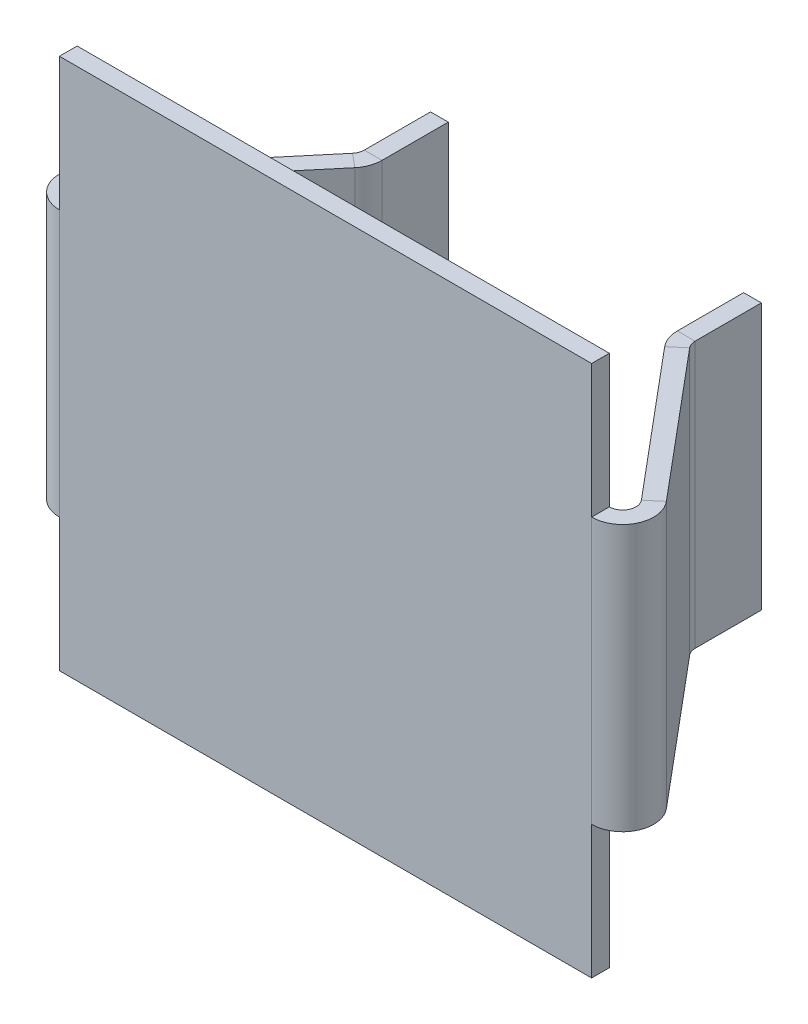
ISO-10303-21;
HEADER;
FILE_DESCRIPTION(('STEP AP214'),'2;1');
FILE_NAME('part.step','',(''),(''),'','','');
FILE_SCHEMA(('AUTOMOTIVE_DESIGN { 1 0 10303 214 1 1 1 1 }'));
ENDSEC;
DATA;
#1=APPLICATION_CONTEXT('core data for automotive mechanical design processes');
#2=APPLICATION_PROTOCOL_DEFINITION('international standard','automotive_design',2000,#1);
#3=PRODUCT_CONTEXT('',#1,'mechanical');
#4=PRODUCT('Part','Part','',(#3));
#5=PRODUCT_RELATED_PRODUCT_CATEGORY('part','',(#4));
#6=PRODUCT_DEFINITION_FORMATION('','',#4);
#7=PRODUCT_DEFINITION_CONTEXT('part definition',#1,'design');
#8=PRODUCT_DEFINITION('design','',#6,#7);
#9=PRODUCT_DEFINITION_SHAPE('','',#8);
#10=(LENGTH_UNIT() NAMED_UNIT(*) SI_UNIT(.MILLI.,.METRE.));
#11=(NAMED_UNIT(*) PLANE_ANGLE_UNIT() SI_UNIT($,.RADIAN.));
#12=(NAMED_UNIT(*) SI_UNIT($,.STERADIAN.) SOLID_ANGLE_UNIT());
#13=UNCERTAINTY_MEASURE_WITH_UNIT(LENGTH_MEASURE(1.E-05),#10,'distance_accuracy_value','');
#14=(GEOMETRIC_REPRESENTATION_CONTEXT(3) GLOBAL_UNCERTAINTY_ASSIGNED_CONTEXT((#13)) GLOBAL_UNIT_ASSIGNED_CONTEXT((#10,
#11,#12)) REPRESENTATION_CONTEXT('',''));
#15=CARTESIAN_POINT('',(0.,0.,0.));
#16=DIRECTION('',(0.,0.,1.));
#17=DIRECTION('',(1.,0.,0.));
#18=AXIS2_PLACEMENT_3D('',#15,#16,#17);
#19=CARTESIAN_POINT('',(46.676759370037,0.,-33.7680866737785));
#20=DIRECTION('',(-0.766044443118979,0.,0.642787609686538));
#21=DIRECTION('',(0.642787609686538,0.,0.766044443118979));
#22=AXIS2_PLACEMENT_3D('',#19,#20,#21);
#23=PLANE('',#22);
#24=DIRECTION('',(-0.642787609686538,0.,-0.766044443118979));
#25=VECTOR('',#24,1.);
#26=CARTESIAN_POINT('',(46.676759370037,-30.,-33.7680866737785));
#27=LINE('',#26,#25);
#28=CARTESIAN_POINT('',(65.3623111018329,-30.,-11.4995132678058));
#29=VERTEX_POINT('',#28);
#30=CARTESIAN_POINT('',(38.0018666706431,-30.,-44.1064212136506));
#31=VERTEX_POINT('',#30);
#32=EDGE_CURVE('E470',#29,#31,#27,.T.);
#33=ORIENTED_EDGE('',*,*,#32,.T.);
#34=DIRECTION('',(0.,1.,0.));
#35=VECTOR('',#34,1.);
#36=CARTESIAN_POINT('',(38.0018666706431,0.,-44.1064212136506));
#37=LINE('',#36,#35);
#38=CARTESIAN_POINT('',(38.0018666706431,30.,-44.1064212136506));
#39=VERTEX_POINT('',#38);
#40=EDGE_CURVE('E94',#31,#39,#37,.T.);
#41=ORIENTED_EDGE('',*,*,#40,.T.);
#42=DIRECTION('',(0.642787609686538,0.,0.766044443118979));
#43=VECTOR('',#42,1.);
#44=CARTESIAN_POINT('',(46.676759370037,30.,-33.7680866737785));
#45=LINE('',#44,#43);
#46=CARTESIAN_POINT('',(65.3623111018328,30.,-11.4995132678058));
#47=VERTEX_POINT('',#46);
#48=EDGE_CURVE('E367',#39,#47,#45,.T.);
#49=ORIENTED_EDGE('',*,*,#48,.T.);
#50=DIRECTION('',(0.,-1.,0.));
#51=VECTOR('',#50,1.);
#52=CARTESIAN_POINT('',(65.3623111018328,30.,-11.4995132678058));
#53=LINE('',#52,#51);
#54=EDGE_CURVE('E339',#29,#47,#53,.F.);
#55=ORIENTED_EDGE('',*,*,#54,.F.);
#56=EDGE_LOOP('',(#33,#41,#49,#55));
#57=FACE_BOUND('',#56,.T.);
#58=ADVANCED_FACE('F85',(#57),#23,.F.);
#59=CARTESIAN_POINT('',(69.4976985340046,30.,-6.57115043874614));
#60=DIRECTION('',(0.,-1.,0.));
#61=DIRECTION('',(0.,0.,-1.));
#62=AXIS2_PLACEMENT_3D('',#59,#60,#61);
#63=PLANE('',#62);
#64=ORIENTED_EDGE('',*,*,#48,.F.);
#65=DIRECTION('',(-0.76604444311898,0.,0.642787609686538));
#66=VECTOR('',#65,1.);
#67=CARTESIAN_POINT('',(38.0018666706431,30.,-44.1064212136506));
#68=LINE('',#67,#66);
#69=CARTESIAN_POINT('',(34.9376888981671,30.,-41.5352707749044));
#70=VERTEX_POINT('',#69);
#71=EDGE_CURVE('E463',#39,#70,#68,.T.);
#72=ORIENTED_EDGE('',*,*,#71,.T.);
#73=DIRECTION('',(-0.642787609686538,0.,-0.766044443118979));
#74=VECTOR('',#73,1.);
#75=CARTESIAN_POINT('',(66.4335207615286,30.,-3.99999999999999));
#76=LINE('',#75,#74);
#77=CARTESIAN_POINT('',(62.2981333293569,30.,-8.9283628290596));
#78=VERTEX_POINT('',#77);
#79=EDGE_CURVE('E89',#70,#78,#76,.F.);
#80=ORIENTED_EDGE('',*,*,#79,.T.);
#81=DIRECTION('',(-0.76604444311898,0.,0.642787609686538));
#82=VECTOR('',#81,1.);
#83=CARTESIAN_POINT('',(65.3623111018328,30.,-11.4995132678058));
#84=LINE('',#83,#82);
#85=EDGE_CURVE('E334',#78,#47,#84,.F.);
#86=ORIENTED_EDGE('',*,*,#85,.T.);
#87=EDGE_LOOP('',(#64,#72,#80,#86));
#88=FACE_BOUND('',#87,.T.);
#89=ADVANCED_FACE('F479',(#88),#63,.F.);
#90=CARTESIAN_POINT('',(26.152266910954,-30.,-58.2282242980635));
#91=DIRECTION('',(0.,1.,0.));
#92=DIRECTION('',(0.,0.,1.));
#93=AXIS2_PLACEMENT_3D('',#90,#91,#92);
#94=PLANE('',#93);
#95=DIRECTION('',(0.642787609686538,0.,0.766044443118979));
#96=VECTOR('',#95,1.);
#97=CARTESIAN_POINT('',(23.0880891384781,-30.,-55.6570738593174));
#98=LINE('',#97,#96);
#99=CARTESIAN_POINT('',(62.2981333293569,-30.,-8.9283628290596));
#100=VERTEX_POINT('',#99);
#101=CARTESIAN_POINT('',(34.9376888981671,-30.,-41.5352707749044));
#102=VERTEX_POINT('',#101);
#103=EDGE_CURVE('E342',#100,#102,#98,.F.);
#104=ORIENTED_EDGE('',*,*,#103,.T.);
#105=DIRECTION('',(0.76604444311898,0.,-0.642787609686538));
#106=VECTOR('',#105,1.);
#107=CARTESIAN_POINT('',(38.0018666706431,-30.,-44.1064212136506));
#108=LINE('',#107,#106);
#109=EDGE_CURVE('E13',#102,#31,#108,.T.);
#110=ORIENTED_EDGE('',*,*,#109,.T.);
#111=ORIENTED_EDGE('',*,*,#32,.F.);
#112=DIRECTION('',(-0.76604444311898,0.,0.642787609686538));
#113=VECTOR('',#112,1.);
#114=CARTESIAN_POINT('',(62.2981333293569,-30.,-8.9283628290596));
#115=LINE('',#114,#113);
#116=EDGE_CURVE('E343',#100,#29,#115,.F.);
#117=ORIENTED_EDGE('',*,*,#116,.F.);
#118=EDGE_LOOP('',(#104,#110,#111,#117));
#119=FACE_BOUND('',#118,.T.);
#120=ADVANCED_FACE('F87',(#119),#94,.F.);
#121=CARTESIAN_POINT('',(-43.6125815975611,0.,-31.1969362350324));
#122=DIRECTION('',(0.766044443118979,0.,0.642787609686538));
#123=DIRECTION('',(0.642787609686538,0.,-0.766044443118979));
#124=AXIS2_PLACEMENT_3D('',#121,#122,#123);
#125=PLANE('',#124);
#126=DIRECTION('',(0.642787609686538,0.,-0.766044443118979));
#127=VECTOR('',#126,1.);
#128=CARTESIAN_POINT('',(-66.4335207615287,-30.,-3.99999999999999));
#129=LINE('',#128,#127);
#130=CARTESIAN_POINT('',(-34.9376888981671,-30.,-41.5352707749045));
#131=VERTEX_POINT('',#130);
#132=CARTESIAN_POINT('',(-62.298133329357,-30.,-8.9283628290596));
#133=VERTEX_POINT('',#132);
#134=EDGE_CURVE('E458',#131,#133,#129,.F.);
#135=ORIENTED_EDGE('',*,*,#134,.F.);
#136=DIRECTION('',(0.,1.,0.));
#137=VECTOR('',#136,1.);
#138=CARTESIAN_POINT('',(-34.9376888981671,0.,-41.5352707749045));
#139=LINE('',#138,#137);
#140=CARTESIAN_POINT('',(-34.9376888981671,30.,-41.5352707749045));
#141=VERTEX_POINT('',#140);
#142=EDGE_CURVE('E437',#131,#141,#139,.T.);
#143=ORIENTED_EDGE('',*,*,#142,.T.);
#144=DIRECTION('',(-0.642787609686538,0.,0.766044443118979));
#145=VECTOR('',#144,1.);
#146=CARTESIAN_POINT('',(-23.0880891384782,30.,-55.6570738593173));
#147=LINE('',#146,#145);
#148=CARTESIAN_POINT('',(-62.298133329357,30.,-8.92836282905961));
#149=VERTEX_POINT('',#148);
#150=EDGE_CURVE('E376',#149,#141,#147,.F.);
#151=ORIENTED_EDGE('',*,*,#150,.F.);
#152=DIRECTION('',(0.,1.,0.));
#153=VECTOR('',#152,1.);
#154=CARTESIAN_POINT('',(-62.298133329357,-30.,-8.9283628290596));
#155=LINE('',#154,#153);
#156=EDGE_CURVE('E380',#133,#149,#155,.T.);
#157=ORIENTED_EDGE('',*,*,#156,.F.);
#158=EDGE_LOOP('',(#135,#143,#151,#157));
#159=FACE_BOUND('',#158,.T.);
#160=ADVANCED_FACE('F570',(#159),#125,.T.);
#161=CARTESIAN_POINT('',(60.,-60.,-4.));
#162=DIRECTION('',(1.,0.,0.));
#163=DIRECTION('',(0.,0.,-1.));
#164=AXIS2_PLACEMENT_3D('',#161,#162,#163);
#165=PLANE('',#164);
#166=DIRECTION('',(0.,1.,0.));
#167=VECTOR('',#166,1.);
#168=CARTESIAN_POINT('',(60.,-60.,-4.));
#169=LINE('',#168,#167);
#170=CARTESIAN_POINT('',(60.,-60.,-4.));
#171=VERTEX_POINT('',#170);
#172=CARTESIAN_POINT('',(60.,-30.,-3.99999999999999));
#173=VERTEX_POINT('',#172);
#174=EDGE_CURVE('E415',#171,#173,#169,.T.);
#175=ORIENTED_EDGE('',*,*,#174,.T.);
#176=DIRECTION('',(0.,0.,1.));
#177=VECTOR('',#176,1.);
#178=CARTESIAN_POINT('',(60.,-30.,-3.99999999999999));
#179=LINE('',#178,#177);
#180=CARTESIAN_POINT('',(60.,-30.,0.));
#181=VERTEX_POINT('',#180);
#182=EDGE_CURVE('E357',#173,#181,#179,.T.);
#183=ORIENTED_EDGE('',*,*,#182,.T.);
#184=DIRECTION('',(0.,1.,0.));
#185=VECTOR('',#184,1.);
#186=CARTESIAN_POINT('',(60.,-60.,0.));
#187=LINE('',#186,#185);
#188=CARTESIAN_POINT('',(60.,-60.,0.));
#189=VERTEX_POINT('',#188);
#190=EDGE_CURVE('E429',#189,#181,#187,.T.);
#191=ORIENTED_EDGE('',*,*,#190,.F.);
#192=DIRECTION('',(0.,0.,1.));
#193=VECTOR('',#192,1.);
#194=CARTESIAN_POINT('',(60.,-60.,-4.));
#195=LINE('',#194,#193);
#196=EDGE_CURVE('E441',#171,#189,#195,.T.);
#197=ORIENTED_EDGE('',*,*,#196,.F.);
#198=EDGE_LOOP('',(#175,#183,#191,#197));
#199=FACE_BOUND('',#198,.T.);
#200=ADVANCED_FACE('F505',(#199),#165,.T.);
#201=CARTESIAN_POINT('',(-60.,-60.,-4.));
#202=DIRECTION('',(-1.,0.,0.));
#203=DIRECTION('',(0.,0.,1.));
#204=AXIS2_PLACEMENT_3D('',#201,#202,#203);
#205=PLANE('',#204);
#206=DIRECTION('',(0.,-1.,0.));
#207=VECTOR('',#206,1.);
#208=CARTESIAN_POINT('',(-60.,-60.,-4.));
#209=LINE('',#208,#207);
#210=CARTESIAN_POINT('',(-60.,60.,-4.));
#211=VERTEX_POINT('',#210);
#212=CARTESIAN_POINT('',(-60.,30.,-3.99999999999998));
#213=VERTEX_POINT('',#212);
#214=EDGE_CURVE('E407',#211,#213,#209,.T.);
#215=ORIENTED_EDGE('',*,*,#214,.T.);
#216=DIRECTION('',(0.,0.,1.));
#217=VECTOR('',#216,1.);
#218=CARTESIAN_POINT('',(-60.,30.,-3.99999999999998));
#219=LINE('',#218,#217);
#220=CARTESIAN_POINT('',(-60.,30.,0.));
#221=VERTEX_POINT('',#220);
#222=EDGE_CURVE('E391',#213,#221,#219,.T.);
#223=ORIENTED_EDGE('',*,*,#222,.T.);
#224=DIRECTION('',(0.,-1.,0.));
#225=VECTOR('',#224,1.);
#226=CARTESIAN_POINT('',(-60.,-60.,0.));
#227=LINE('',#226,#225);
#228=CARTESIAN_POINT('',(-60.,60.,0.));
#229=VERTEX_POINT('',#228);
#230=EDGE_CURVE('E422',#229,#221,#227,.T.);
#231=ORIENTED_EDGE('',*,*,#230,.F.);
#232=DIRECTION('',(0.,0.,1.));
#233=VECTOR('',#232,1.);
#234=CARTESIAN_POINT('',(-60.,60.,-4.));
#235=LINE('',#234,#233);
#236=EDGE_CURVE('E435',#211,#229,#235,.T.);
#237=ORIENTED_EDGE('',*,*,#236,.F.);
#238=EDGE_LOOP('',(#215,#223,#231,#237));
#239=FACE_BOUND('',#238,.T.);
#240=ADVANCED_FACE('F529',(#239),#205,.T.);
#241=DIRECTION('',(0.,0.,1.));
#242=VECTOR('',#241,1.);
#243=CARTESIAN_POINT('',(-60.,-30.,-3.99999999999997));
#244=LINE('',#243,#242);
#245=CARTESIAN_POINT('',(-60.,-30.,-3.99999999999997));
#246=VERTEX_POINT('',#245);
#247=CARTESIAN_POINT('',(-60.,-30.,0.));
#248=VERTEX_POINT('',#247);
#249=EDGE_CURVE('E402',#246,#248,#244,.T.);
#250=ORIENTED_EDGE('',*,*,#249,.F.);
#251=CARTESIAN_POINT('',(-60.,-60.,-4.));
#252=VERTEX_POINT('',#251);
#253=EDGE_CURVE('E411',#246,#252,#209,.T.);
#254=ORIENTED_EDGE('',*,*,#253,.T.);
#255=DIRECTION('',(0.,0.,1.));
#256=VECTOR('',#255,1.);
#257=CARTESIAN_POINT('',(-60.,-60.,-4.));
#258=LINE('',#257,#256);
#259=CARTESIAN_POINT('',(-60.,-60.,0.));
#260=VERTEX_POINT('',#259);
#261=EDGE_CURVE('E421',#252,#260,#258,.T.);
#262=ORIENTED_EDGE('',*,*,#261,.T.);
#263=EDGE_CURVE('E404',#248,#260,#227,.T.);
#264=ORIENTED_EDGE('',*,*,#263,.F.);
#265=EDGE_LOOP('',(#250,#254,#262,#264));
#266=FACE_BOUND('',#265,.T.);
#267=ADVANCED_FACE('F541',(#266),#205,.T.);
#268=CARTESIAN_POINT('',(60.,60.,-4.));
#269=DIRECTION('',(0.,1.,0.));
#270=DIRECTION('',(-1.,0.,0.));
#271=AXIS2_PLACEMENT_3D('',#268,#269,#270);
#272=PLANE('',#271);
#273=DIRECTION('',(-1.,0.,0.));
#274=VECTOR('',#273,1.);
#275=CARTESIAN_POINT('',(60.,60.,0.));
#276=LINE('',#275,#274);
#277=CARTESIAN_POINT('',(60.,60.,0.));
#278=VERTEX_POINT('',#277);
#279=EDGE_CURVE('E432',#278,#229,#276,.T.);
#280=ORIENTED_EDGE('',*,*,#279,.F.);
#281=DIRECTION('',(0.,0.,1.));
#282=VECTOR('',#281,1.);
#283=CARTESIAN_POINT('',(60.,60.,-4.));
#284=LINE('',#283,#282);
#285=CARTESIAN_POINT('',(60.,60.,-4.));
#286=VERTEX_POINT('',#285);
#287=EDGE_CURVE('E438',#286,#278,#284,.T.);
#288=ORIENTED_EDGE('',*,*,#287,.F.);
#289=DIRECTION('',(-1.,0.,0.));
#290=VECTOR('',#289,1.);
#291=CARTESIAN_POINT('',(60.,60.,-4.));
#292=LINE('',#291,#290);
#293=EDGE_CURVE('E418',#286,#211,#292,.T.);
#294=ORIENTED_EDGE('',*,*,#293,.T.);
#295=ORIENTED_EDGE('',*,*,#236,.T.);
#296=EDGE_LOOP('',(#280,#288,#294,#295));
#297=FACE_BOUND('',#296,.T.);
#298=ADVANCED_FACE('F525',(#297),#272,.T.);
#299=DIRECTION('',(0.,0.,1.));
#300=VECTOR('',#299,1.);
#301=CARTESIAN_POINT('',(60.,30.,-3.99999999999999));
#302=LINE('',#301,#300);
#303=CARTESIAN_POINT('',(60.,30.,-3.99999999999999));
#304=VERTEX_POINT('',#303);
#305=CARTESIAN_POINT('',(60.,30.,0.));
#306=VERTEX_POINT('',#305);
#307=EDGE_CURVE('E368',#304,#306,#302,.T.);
#308=ORIENTED_EDGE('',*,*,#307,.F.);
#309=EDGE_CURVE('E414',#304,#286,#169,.T.);
#310=ORIENTED_EDGE('',*,*,#309,.T.);
#311=ORIENTED_EDGE('',*,*,#287,.T.);
#312=EDGE_CURVE('E428',#306,#278,#187,.T.);
#313=ORIENTED_EDGE('',*,*,#312,.F.);
#314=EDGE_LOOP('',(#308,#310,#311,#313));
#315=FACE_BOUND('',#314,.T.);
#316=ADVANCED_FACE('F522',(#315),#165,.T.);
#317=CARTESIAN_POINT('',(60.,-60.,-4.));
#318=DIRECTION('',(0.,-1.,0.));
#319=DIRECTION('',(1.,0.,0.));
#320=AXIS2_PLACEMENT_3D('',#317,#318,#319);
#321=PLANE('',#320);
#322=DIRECTION('',(1.,0.,0.));
#323=VECTOR('',#322,1.);
#324=CARTESIAN_POINT('',(60.,-60.,0.));
#325=LINE('',#324,#323);
#326=EDGE_CURVE('E425',#260,#189,#325,.T.);
#327=ORIENTED_EDGE('',*,*,#326,.F.);
#328=ORIENTED_EDGE('',*,*,#261,.F.);
#329=DIRECTION('',(1.,0.,0.));
#330=VECTOR('',#329,1.);
#331=CARTESIAN_POINT('',(60.,-60.,-4.));
#332=LINE('',#331,#330);
#333=EDGE_CURVE('E410',#252,#171,#332,.T.);
#334=ORIENTED_EDGE('',*,*,#333,.T.);
#335=ORIENTED_EDGE('',*,*,#196,.T.);
#336=EDGE_LOOP('',(#327,#328,#334,#335));
#337=FACE_BOUND('',#336,.T.);
#338=ADVANCED_FACE('F512',(#337),#321,.T.);
#339=CARTESIAN_POINT('',(0.,0.,-4.));
#340=DIRECTION('',(0.,0.,1.));
#341=DIRECTION('',(1.,0.,0.));
#342=AXIS2_PLACEMENT_3D('',#339,#340,#341);
#343=PLANE('',#342);
#344=ORIENTED_EDGE('',*,*,#214,.F.);
#345=ORIENTED_EDGE('',*,*,#293,.F.);
#346=ORIENTED_EDGE('',*,*,#309,.F.);
#347=DIRECTION('',(0.,-1.,0.));
#348=VECTOR('',#347,1.);
#349=CARTESIAN_POINT('',(60.,-30.,-3.99999999999999));
#350=LINE('',#349,#348);
#351=EDGE_CURVE('E362',#173,#304,#350,.F.);
#352=ORIENTED_EDGE('',*,*,#351,.F.);
#353=ORIENTED_EDGE('',*,*,#174,.F.);
#354=ORIENTED_EDGE('',*,*,#333,.F.);
#355=ORIENTED_EDGE('',*,*,#253,.F.);
#356=DIRECTION('',(0.,1.,0.));
#357=VECTOR('',#356,1.);
#358=CARTESIAN_POINT('',(-60.,30.,-3.99999999999998));
#359=LINE('',#358,#357);
#360=EDGE_CURVE('E396',#213,#246,#359,.F.);
#361=ORIENTED_EDGE('',*,*,#360,.F.);
#362=EDGE_LOOP('',(#344,#345,#346,#352,#353,#354,#355,#361));
#363=FACE_BOUND('',#362,.T.);
#364=ADVANCED_FACE('F516',(#363),#343,.F.);
#365=CARTESIAN_POINT('',(0.,0.,0.));
#366=DIRECTION('',(0.,0.,1.));
#367=DIRECTION('',(1.,0.,0.));
#368=AXIS2_PLACEMENT_3D('',#365,#366,#367);
#369=PLANE('',#368);
#370=ORIENTED_EDGE('',*,*,#230,.T.);
#371=DIRECTION('',(0.,1.,0.));
#372=VECTOR('',#371,1.);
#373=CARTESIAN_POINT('',(-60.,30.,0.));
#374=LINE('',#373,#372);
#375=EDGE_CURVE('E384',#221,#248,#374,.F.);
#376=ORIENTED_EDGE('',*,*,#375,.T.);
#377=ORIENTED_EDGE('',*,*,#263,.T.);
#378=ORIENTED_EDGE('',*,*,#326,.T.);
#379=ORIENTED_EDGE('',*,*,#190,.T.);
#380=DIRECTION('',(0.,-1.,0.));
#381=VECTOR('',#380,1.);
#382=CARTESIAN_POINT('',(60.,-30.,0.));
#383=LINE('',#382,#381);
#384=EDGE_CURVE('E350',#181,#306,#383,.F.);
#385=ORIENTED_EDGE('',*,*,#384,.T.);
#386=ORIENTED_EDGE('',*,*,#312,.T.);
#387=ORIENTED_EDGE('',*,*,#279,.T.);
#388=EDGE_LOOP('',(#370,#376,#377,#378,#379,#385,#386,#387));
#389=FACE_BOUND('',#388,.T.);
#390=ADVANCED_FACE('F507',(#389),#369,.T.);
#391=CARTESIAN_POINT('',(-60.,-30.,-6.99999999999998));
#392=DIRECTION('',(0.,-1.,0.));
#393=DIRECTION('',(0.,0.,-1.));
#394=AXIS2_PLACEMENT_3D('',#391,#392,#393);
#395=PLANE('',#394);
#396=DIRECTION('',(0.766044443118979,0.,0.642787609686538));
#397=VECTOR('',#396,1.);
#398=CARTESIAN_POINT('',(-65.3623111018329,-30.,-11.4995132678058));
#399=LINE('',#398,#397);
#400=CARTESIAN_POINT('',(-65.3623111018329,-30.,-11.4995132678058));
#401=VERTEX_POINT('',#400);
#402=EDGE_CURVE('E370',#133,#401,#399,.F.);
#403=ORIENTED_EDGE('',*,*,#402,.F.);
#404=CARTESIAN_POINT('',(-60.,-30.,-6.99999999999998));
#405=DIRECTION('',(0.,1.,0.));
#406=DIRECTION('',(0.,0.,1.));
#407=AXIS2_PLACEMENT_3D('',#404,#405,#406);
#408=CIRCLE('',#407,3.00000000000001);
#409=EDGE_CURVE('E393',#246,#133,#408,.F.);
#410=ORIENTED_EDGE('',*,*,#409,.F.);
#411=ORIENTED_EDGE('',*,*,#249,.T.);
#412=CARTESIAN_POINT('',(-60.,-30.,-6.99999999999998));
#413=DIRECTION('',(0.,1.,0.));
#414=DIRECTION('',(0.,0.,1.));
#415=AXIS2_PLACEMENT_3D('',#412,#413,#414);
#416=CIRCLE('',#415,7.00000000000001);
#417=EDGE_CURVE('E387',#248,#401,#416,.F.);
#418=ORIENTED_EDGE('',*,*,#417,.T.);
#419=EDGE_LOOP('',(#403,#410,#411,#418));
#420=FACE_BOUND('',#419,.T.);
#421=ADVANCED_FACE('F545',(#420),#395,.T.);
#422=CARTESIAN_POINT('',(-60.,30.,-6.99999999999999));
#423=DIRECTION('',(0.,-1.,0.));
#424=DIRECTION('',(0.,0.,-1.));
#425=AXIS2_PLACEMENT_3D('',#422,#423,#424);
#426=PLANE('',#425);
#427=CARTESIAN_POINT('',(-60.,30.,-6.99999999999999));
#428=DIRECTION('',(0.,1.,0.));
#429=DIRECTION('',(0.,0.,1.));
#430=AXIS2_PLACEMENT_3D('',#427,#428,#429);
#431=CIRCLE('',#430,3.00000000000001);
#432=EDGE_CURVE('E398',#149,#213,#431,.T.);
#433=ORIENTED_EDGE('',*,*,#432,.F.);
#434=DIRECTION('',(0.766044443118979,0.,0.642787609686538));
#435=VECTOR('',#434,1.);
#436=CARTESIAN_POINT('',(-62.298133329357,30.,-8.92836282905961));
#437=LINE('',#436,#435);
#438=CARTESIAN_POINT('',(-65.3623111018329,30.,-11.4995132678058));
#439=VERTEX_POINT('',#438);
#440=EDGE_CURVE('E377',#149,#439,#437,.F.);
#441=ORIENTED_EDGE('',*,*,#440,.T.);
#442=CARTESIAN_POINT('',(-60.,30.,-6.99999999999999));
#443=DIRECTION('',(0.,1.,0.));
#444=DIRECTION('',(0.,0.,1.));
#445=AXIS2_PLACEMENT_3D('',#442,#443,#444);
#446=CIRCLE('',#445,7.00000000000001);
#447=EDGE_CURVE('E388',#439,#221,#446,.T.);
#448=ORIENTED_EDGE('',*,*,#447,.T.);
#449=ORIENTED_EDGE('',*,*,#222,.F.);
#450=EDGE_LOOP('',(#433,#441,#448,#449));
#451=FACE_BOUND('',#450,.T.);
#452=ADVANCED_FACE('F532',(#451),#426,.F.);
#453=CARTESIAN_POINT('',(-60.,30.,-6.99999999999999));
#454=DIRECTION('',(0.,1.,0.));
#455=DIRECTION('',(-0.766044443118979,0.,-0.642787609686538));
#456=AXIS2_PLACEMENT_3D('',#453,#454,#455);
#457=CYLINDRICAL_SURFACE('',#456,7.00000000000001);
#458=ORIENTED_EDGE('',*,*,#375,.F.);
#459=ORIENTED_EDGE('',*,*,#447,.F.);
#460=DIRECTION('',(0.,1.,0.));
#461=VECTOR('',#460,1.);
#462=CARTESIAN_POINT('',(-65.3623111018329,-30.,-11.4995132678058));
#463=LINE('',#462,#461);
#464=EDGE_CURVE('E373',#439,#401,#463,.F.);
#465=ORIENTED_EDGE('',*,*,#464,.T.);
#466=ORIENTED_EDGE('',*,*,#417,.F.);
#467=EDGE_LOOP('',(#458,#459,#465,#466));
#468=FACE_BOUND('',#467,.T.);
#469=ADVANCED_FACE('F547',(#468),#457,.T.);
#470=CARTESIAN_POINT('',(-60.,30.,-6.99999999999999));
#471=DIRECTION('',(0.,1.,0.));
#472=DIRECTION('',(-0.766044443118979,0.,-0.642787609686538));
#473=AXIS2_PLACEMENT_3D('',#470,#471,#472);
#474=CYLINDRICAL_SURFACE('',#473,3.00000000000001);
#475=ORIENTED_EDGE('',*,*,#360,.T.);
#476=ORIENTED_EDGE('',*,*,#409,.T.);
#477=ORIENTED_EDGE('',*,*,#156,.T.);
#478=ORIENTED_EDGE('',*,*,#432,.T.);
#479=EDGE_LOOP('',(#475,#476,#477,#478));
#480=FACE_BOUND('',#479,.T.);
#481=ADVANCED_FACE('F536',(#480),#474,.F.);
#482=CARTESIAN_POINT('',(-26.1522669109541,30.,-58.2282242980635));
#483=DIRECTION('',(0.,-1.,0.));
#484=DIRECTION('',(0.,0.,-1.));
#485=AXIS2_PLACEMENT_3D('',#482,#483,#484);
#486=PLANE('',#485);
#487=DIRECTION('',(0.76604444311898,0.,0.642787609686538));
#488=VECTOR('',#487,1.);
#489=CARTESIAN_POINT('',(-38.0018666706431,30.,-44.1064212136506));
#490=LINE('',#489,#488);
#491=CARTESIAN_POINT('',(-38.0018666706431,30.,-44.1064212136506));
#492=VERTEX_POINT('',#491);
#493=EDGE_CURVE('E453',#492,#141,#490,.T.);
#494=ORIENTED_EDGE('',*,*,#493,.F.);
#495=DIRECTION('',(0.642787609686538,0.,-0.766044443118979));
#496=VECTOR('',#495,1.);
#497=CARTESIAN_POINT('',(-46.676759370037,30.,-33.7680866737785));
#498=LINE('',#497,#496);
#499=EDGE_CURVE('E110',#439,#492,#498,.T.);
#500=ORIENTED_EDGE('',*,*,#499,.F.);
#501=ORIENTED_EDGE('',*,*,#440,.F.);
#502=ORIENTED_EDGE('',*,*,#150,.T.);
#503=EDGE_LOOP('',(#494,#500,#501,#502));
#504=FACE_BOUND('',#503,.T.);
#505=ADVANCED_FACE('F550',(#504),#486,.F.);
#506=CARTESIAN_POINT('',(-69.4976985340046,-30.,-6.57115043874614));
#507=DIRECTION('',(0.,1.,0.));
#508=DIRECTION('',(0.,0.,1.));
#509=AXIS2_PLACEMENT_3D('',#506,#507,#508);
#510=PLANE('',#509);
#511=DIRECTION('',(-0.76604444311898,0.,-0.642787609686538));
#512=VECTOR('',#511,1.);
#513=CARTESIAN_POINT('',(-38.0018666706431,-30.,-44.1064212136506));
#514=LINE('',#513,#512);
#515=CARTESIAN_POINT('',(-38.0018666706431,-30.,-44.1064212136506));
#516=VERTEX_POINT('',#515);
#517=EDGE_CURVE('E447',#131,#516,#514,.T.);
#518=ORIENTED_EDGE('',*,*,#517,.F.);
#519=ORIENTED_EDGE('',*,*,#134,.T.);
#520=ORIENTED_EDGE('',*,*,#402,.T.);
#521=DIRECTION('',(-0.642787609686538,0.,0.766044443118979));
#522=VECTOR('',#521,1.);
#523=CARTESIAN_POINT('',(-46.676759370037,-30.,-33.7680866737785));
#524=LINE('',#523,#522);
#525=EDGE_CURVE('E401',#516,#401,#524,.T.);
#526=ORIENTED_EDGE('',*,*,#525,.F.);
#527=EDGE_LOOP('',(#518,#519,#520,#526));
#528=FACE_BOUND('',#527,.T.);
#529=ADVANCED_FACE('F568',(#528),#510,.F.);
#530=CARTESIAN_POINT('',(-46.676759370037,0.,-33.7680866737785));
#531=DIRECTION('',(0.766044443118979,0.,0.642787609686538));
#532=DIRECTION('',(0.642787609686538,0.,-0.766044443118979));
#533=AXIS2_PLACEMENT_3D('',#530,#531,#532);
#534=PLANE('',#533);
#535=DIRECTION('',(0.,1.,0.));
#536=VECTOR('',#535,1.);
#537=CARTESIAN_POINT('',(-38.0018666706431,0.,-44.1064212136506));
#538=LINE('',#537,#536);
#539=EDGE_CURVE('E450',#516,#492,#538,.T.);
#540=ORIENTED_EDGE('',*,*,#539,.F.);
#541=ORIENTED_EDGE('',*,*,#525,.T.);
#542=ORIENTED_EDGE('',*,*,#464,.F.);
#543=ORIENTED_EDGE('',*,*,#499,.T.);
#544=EDGE_LOOP('',(#540,#541,#542,#543));
#545=FACE_BOUND('',#544,.T.);
#546=ADVANCED_FACE('F548',(#545),#534,.F.);
#547=CARTESIAN_POINT('',(60.,30.,-6.99999999999999));
#548=DIRECTION('',(0.,1.,0.));
#549=DIRECTION('',(0.,0.,1.));
#550=AXIS2_PLACEMENT_3D('',#547,#548,#549);
#551=PLANE('',#550);
#552=ORIENTED_EDGE('',*,*,#85,.F.);
#553=CARTESIAN_POINT('',(60.,30.,-6.99999999999999));
#554=DIRECTION('',(0.,-1.,0.));
#555=DIRECTION('',(0.,0.,-1.));
#556=AXIS2_PLACEMENT_3D('',#553,#554,#555);
#557=CIRCLE('',#556,3.);
#558=EDGE_CURVE('E359',#304,#78,#557,.F.);
#559=ORIENTED_EDGE('',*,*,#558,.F.);
#560=ORIENTED_EDGE('',*,*,#307,.T.);
#561=CARTESIAN_POINT('',(60.,30.,-6.99999999999999));
#562=DIRECTION('',(0.,-1.,0.));
#563=DIRECTION('',(0.,0.,-1.));
#564=AXIS2_PLACEMENT_3D('',#561,#562,#563);
#565=CIRCLE('',#564,7.);
#566=EDGE_CURVE('E353',#306,#47,#565,.F.);
#567=ORIENTED_EDGE('',*,*,#566,.T.);
#568=EDGE_LOOP('',(#552,#559,#560,#567));
#569=FACE_BOUND('',#568,.T.);
#570=ADVANCED_FACE('F485',(#569),#551,.T.);
#571=CARTESIAN_POINT('',(60.,-30.,-6.99999999999999));
#572=DIRECTION('',(0.,1.,0.));
#573=DIRECTION('',(0.,0.,1.));
#574=AXIS2_PLACEMENT_3D('',#571,#572,#573);
#575=PLANE('',#574);
#576=CARTESIAN_POINT('',(60.,-30.,-6.99999999999999));
#577=DIRECTION('',(0.,-1.,0.));
#578=DIRECTION('',(0.,0.,-1.));
#579=AXIS2_PLACEMENT_3D('',#576,#577,#578);
#580=CIRCLE('',#579,3.);
#581=EDGE_CURVE('E364',#100,#173,#580,.T.);
#582=ORIENTED_EDGE('',*,*,#581,.F.);
#583=ORIENTED_EDGE('',*,*,#116,.T.);
#584=CARTESIAN_POINT('',(60.,-30.,-6.99999999999999));
#585=DIRECTION('',(0.,-1.,0.));
#586=DIRECTION('',(0.,0.,-1.));
#587=AXIS2_PLACEMENT_3D('',#584,#585,#586);
#588=CIRCLE('',#587,7.);
#589=EDGE_CURVE('E354',#29,#181,#588,.T.);
#590=ORIENTED_EDGE('',*,*,#589,.T.);
#591=ORIENTED_EDGE('',*,*,#182,.F.);
#592=EDGE_LOOP('',(#582,#583,#590,#591));
#593=FACE_BOUND('',#592,.T.);
#594=ADVANCED_FACE('F497',(#593),#575,.F.);
#595=CARTESIAN_POINT('',(60.,-30.,-6.99999999999999));
#596=DIRECTION('',(0.,-1.,0.));
#597=DIRECTION('',(0.766044443118979,0.,-0.642787609686538));
#598=AXIS2_PLACEMENT_3D('',#595,#596,#597);
#599=CYLINDRICAL_SURFACE('',#598,7.);
#600=ORIENTED_EDGE('',*,*,#384,.F.);
#601=ORIENTED_EDGE('',*,*,#589,.F.);
#602=ORIENTED_EDGE('',*,*,#54,.T.);
#603=ORIENTED_EDGE('',*,*,#566,.F.);
#604=EDGE_LOOP('',(#600,#601,#602,#603));
#605=FACE_BOUND('',#604,.T.);
#606=ADVANCED_FACE('F500',(#605),#599,.T.);
#607=CARTESIAN_POINT('',(60.,-30.,-6.99999999999999));
#608=DIRECTION('',(0.,-1.,0.));
#609=DIRECTION('',(0.766044443118979,0.,-0.642787609686538));
#610=AXIS2_PLACEMENT_3D('',#607,#608,#609);
#611=CYLINDRICAL_SURFACE('',#610,3.);
#612=ORIENTED_EDGE('',*,*,#351,.T.);
#613=ORIENTED_EDGE('',*,*,#558,.T.);
#614=DIRECTION('',(0.,-1.,0.));
#615=VECTOR('',#614,1.);
#616=CARTESIAN_POINT('',(62.2981333293569,30.,-8.9283628290596));
#617=LINE('',#616,#615);
#618=EDGE_CURVE('E346',#78,#100,#617,.T.);
#619=ORIENTED_EDGE('',*,*,#618,.T.);
#620=ORIENTED_EDGE('',*,*,#581,.T.);
#621=EDGE_LOOP('',(#612,#613,#619,#620));
#622=FACE_BOUND('',#621,.T.);
#623=ADVANCED_FACE('F489',(#622),#611,.F.);
#624=CARTESIAN_POINT('',(43.6125815975611,0.,-31.1969362350323));
#625=DIRECTION('',(-0.766044443118979,0.,0.642787609686538));
#626=DIRECTION('',(0.642787609686538,0.,0.766044443118979));
#627=AXIS2_PLACEMENT_3D('',#624,#625,#626);
#628=PLANE('',#627);
#629=DIRECTION('',(0.,1.,0.));
#630=VECTOR('',#629,1.);
#631=CARTESIAN_POINT('',(34.9376888981671,0.,-41.5352707749044));
#632=LINE('',#631,#630);
#633=EDGE_CURVE('E456',#102,#70,#632,.T.);
#634=ORIENTED_EDGE('',*,*,#633,.F.);
#635=ORIENTED_EDGE('',*,*,#103,.F.);
#636=ORIENTED_EDGE('',*,*,#618,.F.);
#637=ORIENTED_EDGE('',*,*,#79,.F.);
#638=EDGE_LOOP('',(#634,#635,#636,#637));
#639=FACE_BOUND('',#638,.T.);
#640=ADVANCED_FACE('F493',(#639),#628,.T.);
#641=CARTESIAN_POINT('',(-40.3,-30.,-46.0347840427102));
#642=DIRECTION('',(0.,-1.,0.));
#643=DIRECTION('',(0.,0.,-1.));
#644=AXIS2_PLACEMENT_3D('',#641,#642,#643);
#645=PLANE('',#644);
#646=ORIENTED_EDGE('',*,*,#517,.T.);
#647=CARTESIAN_POINT('',(-40.3,-30.,-46.0347840427102));
#648=DIRECTION('',(0.,1.,0.));
#649=DIRECTION('',(0.,0.,1.));
#650=AXIS2_PLACEMENT_3D('',#647,#648,#649);
#651=CIRCLE('',#650,3.);
#652=CARTESIAN_POINT('',(-37.3,-30.,-46.0347840427102));
#653=VERTEX_POINT('',#652);
#654=EDGE_CURVE('E299',#516,#653,#651,.T.);
#655=ORIENTED_EDGE('',*,*,#654,.T.);
#656=DIRECTION('',(-1.,0.,0.));
#657=VECTOR('',#656,1.);
#658=CARTESIAN_POINT('',(-37.3,-30.,-46.0347840427102));
#659=LINE('',#658,#657);
#660=CARTESIAN_POINT('',(-33.3,-30.,-46.0347840427102));
#661=VERTEX_POINT('',#660);
#662=EDGE_CURVE('E314',#661,#653,#659,.T.);
#663=ORIENTED_EDGE('',*,*,#662,.F.);
#664=CARTESIAN_POINT('',(-40.3,-30.,-46.0347840427102));
#665=DIRECTION('',(0.,1.,0.));
#666=DIRECTION('',(0.,0.,-1.));
#667=AXIS2_PLACEMENT_3D('',#664,#665,#666);
#668=CIRCLE('',#667,7.);
#669=EDGE_CURVE('E327',#131,#661,#668,.T.);
#670=ORIENTED_EDGE('',*,*,#669,.F.);
#671=EDGE_LOOP('',(#646,#655,#663,#670));
#672=FACE_BOUND('',#671,.T.);
#673=ADVANCED_FACE('F564',(#672),#645,.T.);
#674=CARTESIAN_POINT('',(-40.3,30.,-46.0347840427102));
#675=DIRECTION('',(0.,1.,0.));
#676=DIRECTION('',(0.,0.,1.));
#677=AXIS2_PLACEMENT_3D('',#674,#675,#676);
#678=PLANE('',#677);
#679=DIRECTION('',(1.,0.,0.));
#680=VECTOR('',#679,1.);
#681=CARTESIAN_POINT('',(-37.3,30.,-46.0347840427102));
#682=LINE('',#681,#680);
#683=CARTESIAN_POINT('',(-37.3,30.,-46.0347840427102));
#684=VERTEX_POINT('',#683);
#685=CARTESIAN_POINT('',(-33.3,30.,-46.0347840427103));
#686=VERTEX_POINT('',#685);
#687=EDGE_CURVE('E300',#684,#686,#682,.T.);
#688=ORIENTED_EDGE('',*,*,#687,.F.);
#689=CARTESIAN_POINT('',(-40.3,30.,-46.0347840427102));
#690=DIRECTION('',(0.,1.,0.));
#691=DIRECTION('',(0.,0.,1.));
#692=AXIS2_PLACEMENT_3D('',#689,#690,#691);
#693=CIRCLE('',#692,3.);
#694=EDGE_CURVE('E331',#684,#492,#693,.F.);
#695=ORIENTED_EDGE('',*,*,#694,.T.);
#696=ORIENTED_EDGE('',*,*,#493,.T.);
#697=CARTESIAN_POINT('',(-40.3,30.,-46.0347840427102));
#698=DIRECTION('',(0.,-1.,0.));
#699=DIRECTION('',(0.,0.,1.));
#700=AXIS2_PLACEMENT_3D('',#697,#698,#699);
#701=CIRCLE('',#700,7.);
#702=EDGE_CURVE('E330',#686,#141,#701,.T.);
#703=ORIENTED_EDGE('',*,*,#702,.F.);
#704=EDGE_LOOP('',(#688,#695,#696,#703));
#705=FACE_BOUND('',#704,.T.);
#706=ADVANCED_FACE('F556',(#705),#678,.T.);
#707=CARTESIAN_POINT('',(-40.3,-60.4622668881529,-46.0347840427102));
#708=DIRECTION('',(0.,1.,0.));
#709=DIRECTION('',(0.,0.,1.));
#710=AXIS2_PLACEMENT_3D('',#707,#708,#709);
#711=CYLINDRICAL_SURFACE('',#710,7.);
#712=ORIENTED_EDGE('',*,*,#702,.T.);
#713=ORIENTED_EDGE('',*,*,#142,.F.);
#714=ORIENTED_EDGE('',*,*,#669,.T.);
#715=DIRECTION('',(0.,1.,0.));
#716=VECTOR('',#715,1.);
#717=CARTESIAN_POINT('',(-33.3,0.,-46.0347840427102));
#718=LINE('',#717,#716);
#719=EDGE_CURVE('E293',#661,#686,#718,.T.);
#720=ORIENTED_EDGE('',*,*,#719,.T.);
#721=EDGE_LOOP('',(#712,#713,#714,#720));
#722=FACE_BOUND('',#721,.T.);
#723=ADVANCED_FACE('F572',(#722),#711,.T.);
#724=CARTESIAN_POINT('',(-40.3,-60.4622668881529,-46.0347840427102));
#725=DIRECTION('',(0.,1.,0.));
#726=DIRECTION('',(0.,0.,1.));
#727=AXIS2_PLACEMENT_3D('',#724,#725,#726);
#728=CYLINDRICAL_SURFACE('',#727,3.);
#729=ORIENTED_EDGE('',*,*,#694,.F.);
#730=DIRECTION('',(0.,1.,0.));
#731=VECTOR('',#730,1.);
#732=CARTESIAN_POINT('',(-37.3,0.,-46.0347840427102));
#733=LINE('',#732,#731);
#734=EDGE_CURVE('E306',#653,#684,#733,.T.);
#735=ORIENTED_EDGE('',*,*,#734,.F.);
#736=ORIENTED_EDGE('',*,*,#654,.F.);
#737=ORIENTED_EDGE('',*,*,#539,.T.);
#738=EDGE_LOOP('',(#729,#735,#736,#737));
#739=FACE_BOUND('',#738,.T.);
#740=ADVANCED_FACE('F560',(#739),#728,.F.);
#741=CARTESIAN_POINT('',(-37.3,-30.,-60.9788302236292));
#742=DIRECTION('',(0.,0.,1.));
#743=DIRECTION('',(1.,0.,0.));
#744=AXIS2_PLACEMENT_3D('',#741,#742,#743);
#745=PLANE('',#744);
#746=DIRECTION('',(0.,1.,0.));
#747=VECTOR('',#746,1.);
#748=CARTESIAN_POINT('',(-33.3,-30.,-60.9788302236292));
#749=LINE('',#748,#747);
#750=CARTESIAN_POINT('',(-33.3,30.,-60.9788302236292));
#751=VERTEX_POINT('',#750);
#752=CARTESIAN_POINT('',(-33.3,-30.,-60.9788302236292));
#753=VERTEX_POINT('',#752);
#754=EDGE_CURVE('E323',#751,#753,#749,.F.);
#755=ORIENTED_EDGE('',*,*,#754,.T.);
#756=DIRECTION('',(1.,0.,0.));
#757=VECTOR('',#756,1.);
#758=CARTESIAN_POINT('',(-37.3,-30.,-60.9788302236292));
#759=LINE('',#758,#757);
#760=CARTESIAN_POINT('',(-37.3,-30.,-60.9788302236292));
#761=VERTEX_POINT('',#760);
#762=EDGE_CURVE('E311',#761,#753,#759,.T.);
#763=ORIENTED_EDGE('',*,*,#762,.F.);
#764=DIRECTION('',(0.,-1.,0.));
#765=VECTOR('',#764,1.);
#766=CARTESIAN_POINT('',(-37.3,0.,-60.9788302236292));
#767=LINE('',#766,#765);
#768=CARTESIAN_POINT('',(-37.3,30.,-60.9788302236292));
#769=VERTEX_POINT('',#768);
#770=EDGE_CURVE('E302',#769,#761,#767,.T.);
#771=ORIENTED_EDGE('',*,*,#770,.F.);
#772=DIRECTION('',(1.,0.,0.));
#773=VECTOR('',#772,1.);
#774=CARTESIAN_POINT('',(-37.3,30.,-60.9788302236292));
#775=LINE('',#774,#773);
#776=EDGE_CURVE('E320',#769,#751,#775,.T.);
#777=ORIENTED_EDGE('',*,*,#776,.T.);
#778=EDGE_LOOP('',(#755,#763,#771,#777));
#779=FACE_BOUND('',#778,.T.);
#780=ADVANCED_FACE('F584',(#779),#745,.F.);
#781=CARTESIAN_POINT('',(-33.2999999999999,0.,-29.0483882708169));
#782=DIRECTION('',(1.,0.,0.));
#783=DIRECTION('',(0.,0.,-1.));
#784=AXIS2_PLACEMENT_3D('',#781,#782,#783);
#785=PLANE('',#784);
#786=ORIENTED_EDGE('',*,*,#719,.F.);
#787=DIRECTION('',(0.,0.,-1.));
#788=VECTOR('',#787,1.);
#789=CARTESIAN_POINT('',(-33.2999999999998,-30.,6.45469053789949));
#790=LINE('',#789,#788);
#791=EDGE_CURVE('E317',#753,#661,#790,.F.);
#792=ORIENTED_EDGE('',*,*,#791,.F.);
#793=ORIENTED_EDGE('',*,*,#754,.F.);
#794=DIRECTION('',(0.,0.,1.));
#795=VECTOR('',#794,1.);
#796=CARTESIAN_POINT('',(-33.3,30.,-60.9788302236292));
#797=LINE('',#796,#795);
#798=EDGE_CURVE('E297',#686,#751,#797,.F.);
#799=ORIENTED_EDGE('',*,*,#798,.F.);
#800=EDGE_LOOP('',(#786,#792,#793,#799));
#801=FACE_BOUND('',#800,.T.);
#802=ADVANCED_FACE('F576',(#801),#785,.T.);
#803=CARTESIAN_POINT('',(-37.2999999999998,-30.,6.4546905378995));
#804=DIRECTION('',(0.,1.,0.));
#805=DIRECTION('',(0.642787609686541,0.,0.766044443118977));
#806=AXIS2_PLACEMENT_3D('',#803,#804,#805);
#807=PLANE('',#806);
#808=ORIENTED_EDGE('',*,*,#791,.T.);
#809=ORIENTED_EDGE('',*,*,#662,.T.);
#810=DIRECTION('',(0.,0.,1.));
#811=VECTOR('',#810,1.);
#812=CARTESIAN_POINT('',(-37.2999999999999,-30.,-29.0483882708169));
#813=LINE('',#812,#811);
#814=EDGE_CURVE('E309',#761,#653,#813,.T.);
#815=ORIENTED_EDGE('',*,*,#814,.F.);
#816=ORIENTED_EDGE('',*,*,#762,.T.);
#817=EDGE_LOOP('',(#808,#809,#815,#816));
#818=FACE_BOUND('',#817,.T.);
#819=ADVANCED_FACE('F579',(#818),#807,.F.);
#820=CARTESIAN_POINT('',(-37.2999999999999,0.,-29.0483882708169));
#821=DIRECTION('',(1.,0.,0.));
#822=DIRECTION('',(0.,0.,-1.));
#823=AXIS2_PLACEMENT_3D('',#820,#821,#822);
#824=PLANE('',#823);
#825=ORIENTED_EDGE('',*,*,#814,.T.);
#826=ORIENTED_EDGE('',*,*,#734,.T.);
#827=DIRECTION('',(0.,0.,-1.));
#828=VECTOR('',#827,1.);
#829=CARTESIAN_POINT('',(-37.2999999999999,30.,-29.0483882708169));
#830=LINE('',#829,#828);
#831=EDGE_CURVE('E304',#684,#769,#830,.T.);
#832=ORIENTED_EDGE('',*,*,#831,.T.);
#833=ORIENTED_EDGE('',*,*,#770,.T.);
#834=EDGE_LOOP('',(#825,#826,#832,#833));
#835=FACE_BOUND('',#834,.T.);
#836=ADVANCED_FACE('F589',(#835),#824,.F.);
#837=CARTESIAN_POINT('',(-37.3,30.,-60.9788302236292));
#838=DIRECTION('',(0.,-1.,0.));
#839=DIRECTION('',(-0.642787609686541,0.,-0.766044443118977));
#840=AXIS2_PLACEMENT_3D('',#837,#838,#839);
#841=PLANE('',#840);
#842=ORIENTED_EDGE('',*,*,#831,.F.);
#843=ORIENTED_EDGE('',*,*,#687,.T.);
#844=ORIENTED_EDGE('',*,*,#798,.T.);
#845=ORIENTED_EDGE('',*,*,#776,.F.);
#846=EDGE_LOOP('',(#842,#843,#844,#845));
#847=FACE_BOUND('',#846,.T.);
#848=ADVANCED_FACE('F587',(#847),#841,.F.);
#849=CARTESIAN_POINT('',(40.3,-30.,-46.0347840427102));
#850=DIRECTION('',(0.,-1.,0.));
#851=DIRECTION('',(0.,0.,-1.));
#852=AXIS2_PLACEMENT_3D('',#849,#850,#851);
#853=PLANE('',#852);
#854=DIRECTION('',(1.,0.,0.));
#855=VECTOR('',#854,1.);
#856=CARTESIAN_POINT('',(37.3,-30.,-46.0347840427102));
#857=LINE('',#856,#855);
#858=CARTESIAN_POINT('',(33.3,-30.,-46.0347840427102));
#859=VERTEX_POINT('',#858);
#860=CARTESIAN_POINT('',(37.3,-30.,-46.0347840427102));
#861=VERTEX_POINT('',#860);
#862=EDGE_CURVE('E256',#859,#861,#857,.T.);
#863=ORIENTED_EDGE('',*,*,#862,.T.);
#864=CARTESIAN_POINT('',(40.3,-29.9999999999999,-46.0347840427102));
#865=DIRECTION('',(0.,-1.,0.));
#866=DIRECTION('',(1.,0.,0.));
#867=AXIS2_PLACEMENT_3D('',#864,#865,#866);
#868=CIRCLE('',#867,3.);
#869=EDGE_CURVE('E102',#861,#31,#868,.F.);
#870=ORIENTED_EDGE('',*,*,#869,.T.);
#871=ORIENTED_EDGE('',*,*,#109,.F.);
#872=CARTESIAN_POINT('',(40.3,-30.,-46.0347840427102));
#873=DIRECTION('',(0.,1.,0.));
#874=DIRECTION('',(0.,0.,-1.));
#875=AXIS2_PLACEMENT_3D('',#872,#873,#874);
#876=CIRCLE('',#875,7.);
#877=EDGE_CURVE('E286',#859,#102,#876,.T.);
#878=ORIENTED_EDGE('',*,*,#877,.F.);
#879=EDGE_LOOP('',(#863,#870,#871,#878));
#880=FACE_BOUND('',#879,.T.);
#881=ADVANCED_FACE('F596',(#880),#853,.T.);
#882=CARTESIAN_POINT('',(40.3,30.,-46.0347840427102));
#883=DIRECTION('',(0.,1.,0.));
#884=DIRECTION('',(0.,0.,1.));
#885=AXIS2_PLACEMENT_3D('',#882,#883,#884);
#886=PLANE('',#885);
#887=CARTESIAN_POINT('',(40.3,30.,-46.0347840427102));
#888=DIRECTION('',(0.,-1.,0.));
#889=DIRECTION('',(1.,0.,0.));
#890=AXIS2_PLACEMENT_3D('',#887,#888,#889);
#891=CIRCLE('',#890,3.);
#892=CARTESIAN_POINT('',(37.3,30.,-46.0347840427102));
#893=VERTEX_POINT('',#892);
#894=EDGE_CURVE('E290',#39,#893,#891,.T.);
#895=ORIENTED_EDGE('',*,*,#894,.T.);
#896=DIRECTION('',(-1.,0.,0.));
#897=VECTOR('',#896,1.);
#898=CARTESIAN_POINT('',(37.3,30.,-46.0347840427102));
#899=LINE('',#898,#897);
#900=CARTESIAN_POINT('',(33.3,30.,-46.0347840427102));
#901=VERTEX_POINT('',#900);
#902=EDGE_CURVE('E269',#893,#901,#899,.T.);
#903=ORIENTED_EDGE('',*,*,#902,.T.);
#904=CARTESIAN_POINT('',(40.3,30.,-46.0347840427102));
#905=DIRECTION('',(0.,-1.,0.));
#906=DIRECTION('',(0.,0.,1.));
#907=AXIS2_PLACEMENT_3D('',#904,#905,#906);
#908=CIRCLE('',#907,7.);
#909=EDGE_CURVE('E289',#70,#901,#908,.T.);
#910=ORIENTED_EDGE('',*,*,#909,.F.);
#911=ORIENTED_EDGE('',*,*,#71,.F.);
#912=EDGE_LOOP('',(#895,#903,#910,#911));
#913=FACE_BOUND('',#912,.T.);
#914=ADVANCED_FACE('F724',(#913),#886,.T.);
#915=CARTESIAN_POINT('',(40.3,60.462266888153,-46.0347840427102));
#916=DIRECTION('',(0.,-1.,0.));
#917=DIRECTION('',(1.,0.,0.));
#918=AXIS2_PLACEMENT_3D('',#915,#916,#917);
#919=CYLINDRICAL_SURFACE('',#918,7.);
#920=ORIENTED_EDGE('',*,*,#633,.T.);
#921=ORIENTED_EDGE('',*,*,#909,.T.);
#922=DIRECTION('',(0.,1.,0.));
#923=VECTOR('',#922,1.);
#924=CARTESIAN_POINT('',(33.3,0.,-46.0347840427102));
#925=LINE('',#924,#923);
#926=EDGE_CURVE('E274',#859,#901,#925,.T.);
#927=ORIENTED_EDGE('',*,*,#926,.F.);
#928=ORIENTED_EDGE('',*,*,#877,.T.);
#929=EDGE_LOOP('',(#920,#921,#927,#928));
#930=FACE_BOUND('',#929,.T.);
#931=ADVANCED_FACE('F734',(#930),#919,.T.);
#932=CARTESIAN_POINT('',(40.3,60.462266888153,-46.0347840427102));
#933=DIRECTION('',(0.,-1.,0.));
#934=DIRECTION('',(1.,0.,0.));
#935=AXIS2_PLACEMENT_3D('',#932,#933,#934);
#936=CYLINDRICAL_SURFACE('',#935,3.);
#937=ORIENTED_EDGE('',*,*,#40,.F.);
#938=ORIENTED_EDGE('',*,*,#869,.F.);
#939=DIRECTION('',(0.,1.,0.));
#940=VECTOR('',#939,1.);
#941=CARTESIAN_POINT('',(37.3,0.,-46.0347840427102));
#942=LINE('',#941,#940);
#943=EDGE_CURVE('E282',#861,#893,#942,.T.);
#944=ORIENTED_EDGE('',*,*,#943,.T.);
#945=ORIENTED_EDGE('',*,*,#894,.F.);
#946=EDGE_LOOP('',(#937,#938,#944,#945));
#947=FACE_BOUND('',#946,.T.);
#948=ADVANCED_FACE('F745',(#947),#936,.F.);
#949=CARTESIAN_POINT('',(37.3,30.,-60.9788302236292));
#950=DIRECTION('',(0.,0.,1.));
#951=DIRECTION('',(1.,0.,0.));
#952=AXIS2_PLACEMENT_3D('',#949,#950,#951);
#953=PLANE('',#952);
#954=DIRECTION('',(0.,-1.,0.));
#955=VECTOR('',#954,1.);
#956=CARTESIAN_POINT('',(33.3,30.,-60.9788302236292));
#957=LINE('',#956,#955);
#958=CARTESIAN_POINT('',(33.3,-30.,-60.9788302236292));
#959=VERTEX_POINT('',#958);
#960=CARTESIAN_POINT('',(33.3,30.,-60.9788302236292));
#961=VERTEX_POINT('',#960);
#962=EDGE_CURVE('E262',#959,#961,#957,.F.);
#963=ORIENTED_EDGE('',*,*,#962,.T.);
#964=DIRECTION('',(-1.,0.,0.));
#965=VECTOR('',#964,1.);
#966=CARTESIAN_POINT('',(37.3,30.,-60.9788302236292));
#967=LINE('',#966,#965);
#968=CARTESIAN_POINT('',(37.3,30.,-60.9788302236292));
#969=VERTEX_POINT('',#968);
#970=EDGE_CURVE('E276',#969,#961,#967,.T.);
#971=ORIENTED_EDGE('',*,*,#970,.F.);
#972=DIRECTION('',(0.,1.,0.));
#973=VECTOR('',#972,1.);
#974=CARTESIAN_POINT('',(37.3,0.,-60.9788302236292));
#975=LINE('',#974,#973);
#976=CARTESIAN_POINT('',(37.3,-30.,-60.9788302236292));
#977=VERTEX_POINT('',#976);
#978=EDGE_CURVE('E273',#977,#969,#975,.T.);
#979=ORIENTED_EDGE('',*,*,#978,.F.);
#980=DIRECTION('',(-1.,0.,0.));
#981=VECTOR('',#980,1.);
#982=CARTESIAN_POINT('',(37.3,-30.,-60.9788302236292));
#983=LINE('',#982,#981);
#984=EDGE_CURVE('E255',#977,#959,#983,.T.);
#985=ORIENTED_EDGE('',*,*,#984,.T.);
#986=EDGE_LOOP('',(#963,#971,#979,#985));
#987=FACE_BOUND('',#986,.T.);
#988=ADVANCED_FACE('F272',(#987),#953,.F.);
#989=CARTESIAN_POINT('',(33.2999999999999,0.,-29.0483882708169));
#990=DIRECTION('',(-1.,0.,0.));
#991=DIRECTION('',(0.,0.,1.));
#992=AXIS2_PLACEMENT_3D('',#989,#990,#991);
#993=PLANE('',#992);
#994=DIRECTION('',(0.,0.,1.));
#995=VECTOR('',#994,1.);
#996=CARTESIAN_POINT('',(33.3,-30.,-60.9788302236292));
#997=LINE('',#996,#995);
#998=EDGE_CURVE('E251',#859,#959,#997,.F.);
#999=ORIENTED_EDGE('',*,*,#998,.F.);
#1000=ORIENTED_EDGE('',*,*,#926,.T.);
#1001=DIRECTION('',(0.,0.,-1.));
#1002=VECTOR('',#1001,1.);
#1003=CARTESIAN_POINT('',(33.2999999999998,30.,6.45469053789947));
#1004=LINE('',#1003,#1002);
#1005=EDGE_CURVE('E265',#961,#901,#1004,.F.);
#1006=ORIENTED_EDGE('',*,*,#1005,.F.);
#1007=ORIENTED_EDGE('',*,*,#962,.F.);
#1008=EDGE_LOOP('',(#999,#1000,#1006,#1007));
#1009=FACE_BOUND('',#1008,.T.);
#1010=ADVANCED_FACE('F263',(#1009),#993,.T.);
#1011=CARTESIAN_POINT('',(37.2999999999998,30.,6.45469053789949));
#1012=DIRECTION('',(0.,-1.,0.));
#1013=DIRECTION('',(0.642787609686541,0.,-0.766044443118977));
#1014=AXIS2_PLACEMENT_3D('',#1011,#1012,#1013);
#1015=PLANE('',#1014);
#1016=ORIENTED_EDGE('',*,*,#902,.F.);
#1017=DIRECTION('',(0.,0.,1.));
#1018=VECTOR('',#1017,1.);
#1019=CARTESIAN_POINT('',(37.2999999999999,30.,-29.0483882708169));
#1020=LINE('',#1019,#1018);
#1021=EDGE_CURVE('E259',#969,#893,#1020,.T.);
#1022=ORIENTED_EDGE('',*,*,#1021,.F.);
#1023=ORIENTED_EDGE('',*,*,#970,.T.);
#1024=ORIENTED_EDGE('',*,*,#1005,.T.);
#1025=EDGE_LOOP('',(#1016,#1022,#1023,#1024));
#1026=FACE_BOUND('',#1025,.T.);
#1027=ADVANCED_FACE('F775',(#1026),#1015,.F.);
#1028=CARTESIAN_POINT('',(37.2999999999999,0.,-29.0483882708169));
#1029=DIRECTION('',(-1.,0.,0.));
#1030=DIRECTION('',(0.,0.,1.));
#1031=AXIS2_PLACEMENT_3D('',#1028,#1029,#1030);
#1032=PLANE('',#1031);
#1033=ORIENTED_EDGE('',*,*,#943,.F.);
#1034=DIRECTION('',(0.,0.,-1.));
#1035=VECTOR('',#1034,1.);
#1036=CARTESIAN_POINT('',(37.2999999999999,-30.,-29.0483882708169));
#1037=LINE('',#1036,#1035);
#1038=EDGE_CURVE('E819',#861,#977,#1037,.T.);
#1039=ORIENTED_EDGE('',*,*,#1038,.T.);
#1040=ORIENTED_EDGE('',*,*,#978,.T.);
#1041=ORIENTED_EDGE('',*,*,#1021,.T.);
#1042=EDGE_LOOP('',(#1033,#1039,#1040,#1041));
#1043=FACE_BOUND('',#1042,.T.);
#1044=ADVANCED_FACE('F785',(#1043),#1032,.F.);
#1045=CARTESIAN_POINT('',(37.3,-30.,-60.9788302236292));
#1046=DIRECTION('',(0.,1.,0.));
#1047=DIRECTION('',(-0.642787609686541,0.,0.766044443118977));
#1048=AXIS2_PLACEMENT_3D('',#1045,#1046,#1047);
#1049=PLANE('',#1048);
#1050=ORIENTED_EDGE('',*,*,#862,.F.);
#1051=ORIENTED_EDGE('',*,*,#998,.T.);
#1052=ORIENTED_EDGE('',*,*,#984,.F.);
#1053=ORIENTED_EDGE('',*,*,#1038,.F.);
#1054=EDGE_LOOP('',(#1050,#1051,#1052,#1053));
#1055=FACE_BOUND('',#1054,.T.);
#1056=ADVANCED_FACE('F253',(#1055),#1049,.F.);
#1057=CLOSED_SHELL('',(#58,#89,#120,#160,#200,#240,#267,#298,#316,#338,#364,#390,#421,#452,#469,
#481,#505,#529,#546,#570,#594,#606,#623,#640,#673,#706,#723,#740,#780,#802,#819,#836,#848,#881,
#914,#931,#948,#988,#1010,#1027,#1044,#1056));
#1058=MANIFOLD_SOLID_BREP('B2',#1057);
#1059=ADVANCED_BREP_SHAPE_REPRESENTATION('',(#18,#1058),#14);
#1060=SHAPE_DEFINITION_REPRESENTATION(#9,#1059);
ENDSEC;
END-ISO-10303-21;
